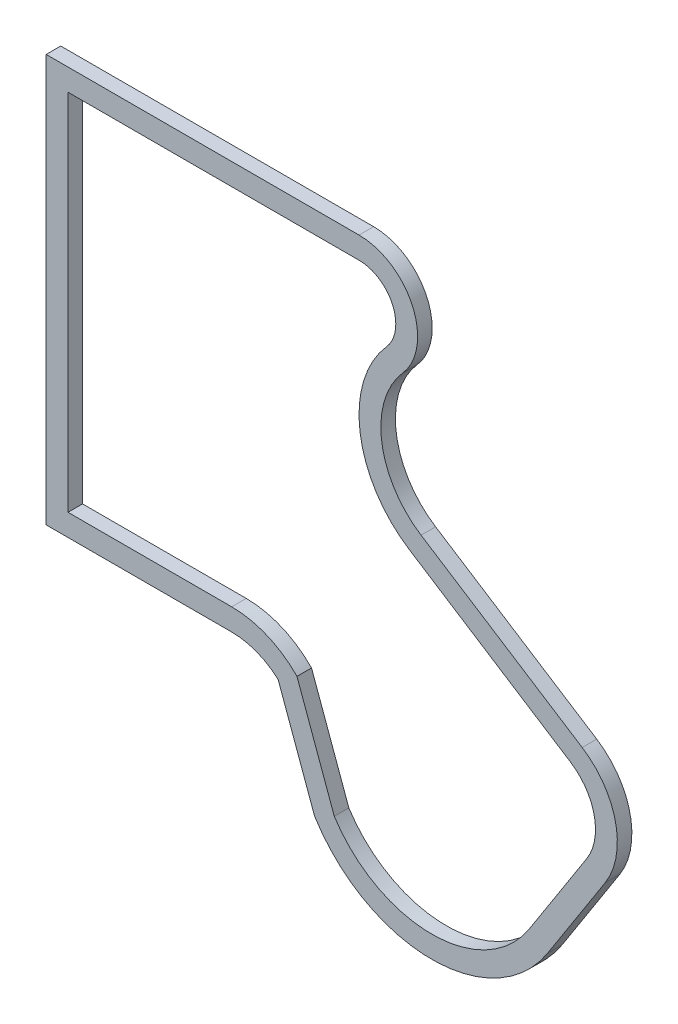
ISO-10303-21;
HEADER;
FILE_DESCRIPTION(('STEP AP214'),'2;1');
FILE_NAME('part.step','',(''),(''),'','','');
FILE_SCHEMA(('AUTOMOTIVE_DESIGN { 1 0 10303 214 1 1 1 1 }'));
ENDSEC;
DATA;
#1=APPLICATION_CONTEXT('core data for automotive mechanical design processes');
#2=APPLICATION_PROTOCOL_DEFINITION('international standard','automotive_design',2000,#1);
#3=PRODUCT_CONTEXT('',#1,'mechanical');
#4=PRODUCT('Part','Part','',(#3));
#5=PRODUCT_RELATED_PRODUCT_CATEGORY('part','',(#4));
#6=PRODUCT_DEFINITION_FORMATION('','',#4);
#7=PRODUCT_DEFINITION_CONTEXT('part definition',#1,'design');
#8=PRODUCT_DEFINITION('design','',#6,#7);
#9=PRODUCT_DEFINITION_SHAPE('','',#8);
#10=(LENGTH_UNIT() NAMED_UNIT(*) SI_UNIT(.MILLI.,.METRE.));
#11=(NAMED_UNIT(*) PLANE_ANGLE_UNIT() SI_UNIT($,.RADIAN.));
#12=(NAMED_UNIT(*) SI_UNIT($,.STERADIAN.) SOLID_ANGLE_UNIT());
#13=UNCERTAINTY_MEASURE_WITH_UNIT(LENGTH_MEASURE(1.E-05),#10,'distance_accuracy_value','');
#14=(GEOMETRIC_REPRESENTATION_CONTEXT(3) GLOBAL_UNCERTAINTY_ASSIGNED_CONTEXT((#13)) GLOBAL_UNIT_ASSIGNED_CONTEXT((#10,
#11,#12)) REPRESENTATION_CONTEXT('',''));
#15=CARTESIAN_POINT('',(0.,0.,0.));
#16=DIRECTION('',(0.,0.,1.));
#17=DIRECTION('',(1.,0.,0.));
#18=AXIS2_PLACEMENT_3D('',#15,#16,#17);
#19=CARTESIAN_POINT('',(57.15,-31.75,5.08));
#20=DIRECTION('',(0.,0.,-1.));
#21=DIRECTION('',(-1.,0.,0.));
#22=AXIS2_PLACEMENT_3D('',#19,#20,#21);
#23=PLANE('',#22);
#24=DIRECTION('',(1.,0.,0.));
#25=VECTOR('',#24,1.);
#26=CARTESIAN_POINT('',(-7.62,-7.62,5.08));
#27=LINE('',#26,#25);
#28=CARTESIAN_POINT('',(-7.62,-7.62,5.08));
#29=VERTEX_POINT('',#28);
#30=CARTESIAN_POINT('',(57.15,-7.62,5.08));
#31=VERTEX_POINT('',#30);
#32=EDGE_CURVE('E311',#29,#31,#27,.T.);
#33=ORIENTED_EDGE('',*,*,#32,.T.);
#34=CARTESIAN_POINT('',(57.15,-31.75,5.08));
#35=DIRECTION('',(0.,0.,-1.));
#36=DIRECTION('',(-1.,0.,0.));
#37=AXIS2_PLACEMENT_3D('',#34,#35,#36);
#38=CIRCLE('',#37,24.13);
#39=CARTESIAN_POINT('',(73.3701951159205,-13.8848895776861,5.08));
#40=VERTEX_POINT('',#39);
#41=EDGE_CURVE('E315',#31,#40,#38,.T.);
#42=ORIENTED_EDGE('',*,*,#41,.T.);
#43=DIRECTION('',(0.342020143325669,-0.939692620785908,0.));
#44=VECTOR('',#43,1.);
#45=CARTESIAN_POINT('',(73.3701951159205,-13.8848895776861,5.08));
#46=LINE('',#45,#44);
#47=CARTESIAN_POINT('',(86.0802479004247,-48.8054726031877,5.08));
#48=VERTEX_POINT('',#47);
#49=EDGE_CURVE('E319',#40,#48,#46,.T.);
#50=ORIENTED_EDGE('',*,*,#49,.T.);
#51=CARTESIAN_POINT('',(127.,-23.6138442919467,5.08));
#52=DIRECTION('',(0.,0.,1.));
#53=DIRECTION('',(1.,0.,0.));
#54=AXIS2_PLACEMENT_3D('',#51,#52,#53);
#55=CIRCLE('',#54,48.0525155310564);
#56=CARTESIAN_POINT('',(167.450498741756,-49.552259825776,5.08));
#57=VERTEX_POINT('',#56);
#58=EDGE_CURVE('E322',#48,#57,#55,.T.);
#59=ORIENTED_EDGE('',*,*,#58,.T.);
#60=DIRECTION('',(0.539793083612144,0.84179773513861,0.));
#61=VECTOR('',#60,1.);
#62=CARTESIAN_POINT('',(167.450498741756,-49.552259825776,5.08));
#63=LINE('',#62,#61);
#64=CARTESIAN_POINT('',(187.550745596147,-18.2062815399359,5.08));
#65=VERTEX_POINT('',#64);
#66=EDGE_CURVE('E325',#57,#65,#63,.T.);
#67=ORIENTED_EDGE('',*,*,#66,.T.);
#68=CARTESIAN_POINT('',(165.1,-3.81000000000001,5.08));
#69=DIRECTION('',(0.,0.,1.));
#70=DIRECTION('',(-1.,0.,0.));
#71=AXIS2_PLACEMENT_3D('',#68,#69,#70);
#72=CIRCLE('',#71,26.67);
#73=CARTESIAN_POINT('',(179.496281539936,18.6407455961467,5.08));
#74=VERTEX_POINT('',#73);
#75=EDGE_CURVE('E328',#65,#74,#72,.T.);
#76=ORIENTED_EDGE('',*,*,#75,.T.);
#77=DIRECTION('',(-0.84179773513861,0.539793083612144,0.));
#78=VECTOR('',#77,1.);
#79=CARTESIAN_POINT('',(123.247106811502,54.7098797953497,5.08));
#80=LINE('',#79,#78);
#81=CARTESIAN_POINT('',(123.247106811502,54.7098797953497,5.08));
#82=VERTEX_POINT('',#81);
#83=EDGE_CURVE('E331',#74,#82,#80,.T.);
#84=ORIENTED_EDGE('',*,*,#83,.T.);
#85=CARTESIAN_POINT('',(139.7,80.3678747623745,5.08));
#86=DIRECTION('',(0.,0.,-1.));
#87=DIRECTION('',(1.,0.,0.));
#88=AXIS2_PLACEMENT_3D('',#85,#86,#87);
#89=CIRCLE('',#88,30.48);
#90=CARTESIAN_POINT('',(116.899219219543,100.595449896373,5.08));
#91=VERTEX_POINT('',#90);
#92=EDGE_CURVE('E334',#82,#91,#89,.T.);
#93=ORIENTED_EDGE('',*,*,#92,.T.);
#94=CARTESIAN_POINT('',(101.6,114.168059941379,5.08));
#95=DIRECTION('',(0.,0.,1.));
#96=DIRECTION('',(-1.,0.,0.));
#97=AXIS2_PLACEMENT_3D('',#94,#95,#96);
#98=CIRCLE('',#97,20.4519400586212);
#99=CARTESIAN_POINT('',(101.6,134.62,5.08));
#100=VERTEX_POINT('',#99);
#101=EDGE_CURVE('E337',#91,#100,#98,.T.);
#102=ORIENTED_EDGE('',*,*,#101,.T.);
#103=DIRECTION('',(-1.,0.,0.));
#104=VECTOR('',#103,1.);
#105=CARTESIAN_POINT('',(-7.62,134.62,5.08));
#106=LINE('',#105,#104);
#107=CARTESIAN_POINT('',(-7.62,134.62,5.08));
#108=VERTEX_POINT('',#107);
#109=EDGE_CURVE('E340',#100,#108,#106,.T.);
#110=ORIENTED_EDGE('',*,*,#109,.T.);
#111=DIRECTION('',(0.,-1.,0.));
#112=VECTOR('',#111,1.);
#113=CARTESIAN_POINT('',(-7.62,-7.62,5.08));
#114=LINE('',#113,#112);
#115=EDGE_CURVE('E343',#108,#29,#114,.T.);
#116=ORIENTED_EDGE('',*,*,#115,.T.);
#117=EDGE_LOOP('',(#33,#42,#50,#59,#67,#76,#84,#93,#102,#110,#116));
#118=FACE_BOUND('',#117,.T.);
#119=DIRECTION('',(1.,0.,0.));
#120=VECTOR('',#119,1.);
#121=CARTESIAN_POINT('',(0.,0.,5.08));
#122=LINE('',#121,#120);
#123=CARTESIAN_POINT('',(0.,0.,5.08));
#124=VERTEX_POINT('',#123);
#125=CARTESIAN_POINT('',(57.15,0.,5.08));
#126=VERTEX_POINT('',#125);
#127=EDGE_CURVE('E191',#124,#126,#122,.T.);
#128=ORIENTED_EDGE('',*,*,#127,.F.);
#129=DIRECTION('',(0.,-1.,0.));
#130=VECTOR('',#129,1.);
#131=CARTESIAN_POINT('',(0.,0.,5.08));
#132=LINE('',#131,#130);
#133=CARTESIAN_POINT('',(0.,127.,5.08));
#134=VERTEX_POINT('',#133);
#135=EDGE_CURVE('E242',#134,#124,#132,.T.);
#136=ORIENTED_EDGE('',*,*,#135,.F.);
#137=DIRECTION('',(-1.,0.,0.));
#138=VECTOR('',#137,1.);
#139=CARTESIAN_POINT('',(0.,127.,5.08));
#140=LINE('',#139,#138);
#141=CARTESIAN_POINT('',(101.6,127.,5.08));
#142=VERTEX_POINT('',#141);
#143=EDGE_CURVE('E239',#142,#134,#140,.T.);
#144=ORIENTED_EDGE('',*,*,#143,.F.);
#145=CARTESIAN_POINT('',(101.6,114.168059941379,5.08));
#146=DIRECTION('',(0.,0.,1.));
#147=DIRECTION('',(-1.,0.,0.));
#148=AXIS2_PLACEMENT_3D('',#145,#146,#147);
#149=CIRCLE('',#148,12.8319400586212);
#150=CARTESIAN_POINT('',(111.199024024429,105.652343679872,5.08));
#151=VERTEX_POINT('',#150);
#152=EDGE_CURVE('E236',#151,#142,#149,.T.);
#153=ORIENTED_EDGE('',*,*,#152,.F.);
#154=CARTESIAN_POINT('',(139.7,80.3678747623745,5.08));
#155=DIRECTION('',(0.,0.,-1.));
#156=DIRECTION('',(1.,0.,0.));
#157=AXIS2_PLACEMENT_3D('',#154,#155,#156);
#158=CIRCLE('',#157,38.1);
#159=CARTESIAN_POINT('',(119.133883514377,48.2953810535935,5.08));
#160=VERTEX_POINT('',#159);
#161=EDGE_CURVE('E233',#160,#151,#158,.T.);
#162=ORIENTED_EDGE('',*,*,#161,.F.);
#163=DIRECTION('',(-0.84179773513861,0.539793083612144,0.));
#164=VECTOR('',#163,1.);
#165=CARTESIAN_POINT('',(119.133883514377,48.2953810535935,5.08));
#166=LINE('',#165,#164);
#167=CARTESIAN_POINT('',(175.383058242811,12.2262468543905,5.08));
#168=VERTEX_POINT('',#167);
#169=EDGE_CURVE('E230',#168,#160,#166,.T.);
#170=ORIENTED_EDGE('',*,*,#169,.F.);
#171=CARTESIAN_POINT('',(165.1,-3.81000000000001,5.08));
#172=DIRECTION('',(0.,0.,1.));
#173=DIRECTION('',(-1.,0.,0.));
#174=AXIS2_PLACEMENT_3D('',#171,#172,#173);
#175=CIRCLE('',#174,19.05);
#176=CARTESIAN_POINT('',(181.136246854391,-14.0930582428113,5.08));
#177=VERTEX_POINT('',#176);
#178=EDGE_CURVE('E227',#177,#168,#175,.T.);
#179=ORIENTED_EDGE('',*,*,#178,.F.);
#180=DIRECTION('',(0.539793083612144,0.84179773513861,0.));
#181=VECTOR('',#180,1.);
#182=CARTESIAN_POINT('',(161.036,-45.4390365286515,5.08));
#183=LINE('',#182,#181);
#184=CARTESIAN_POINT('',(161.036,-45.4390365286515,5.08));
#185=VERTEX_POINT('',#184);
#186=EDGE_CURVE('E224',#185,#177,#183,.T.);
#187=ORIENTED_EDGE('',*,*,#186,.F.);
#188=CARTESIAN_POINT('',(127.,-23.6138442919467,5.08));
#189=DIRECTION('',(0.,0.,1.));
#190=DIRECTION('',(1.,0.,0.));
#191=AXIS2_PLACEMENT_3D('',#188,#189,#190);
#192=CIRCLE('',#191,40.4325155310564);
#193=CARTESIAN_POINT('',(92.964,-45.4390365286515,5.08));
#194=VERTEX_POINT('',#193);
#195=EDGE_CURVE('E219',#194,#185,#192,.T.);
#196=ORIENTED_EDGE('',*,*,#195,.F.);
#197=DIRECTION('',(0.342020143325669,-0.939692620785908,0.));
#198=VECTOR('',#197,1.);
#199=CARTESIAN_POINT('',(79.933032539292,-9.63674767670839,5.08));
#200=LINE('',#199,#198);
#201=CARTESIAN_POINT('',(79.933032539292,-9.63674767670839,5.08));
#202=VERTEX_POINT('',#201);
#203=EDGE_CURVE('E214',#202,#194,#200,.T.);
#204=ORIENTED_EDGE('',*,*,#203,.F.);
#205=CARTESIAN_POINT('',(57.15,-31.75,5.08));
#206=DIRECTION('',(0.,0.,-1.));
#207=DIRECTION('',(-1.,0.,0.));
#208=AXIS2_PLACEMENT_3D('',#205,#206,#207);
#209=CIRCLE('',#208,31.75);
#210=EDGE_CURVE('E200',#126,#202,#209,.T.);
#211=ORIENTED_EDGE('',*,*,#210,.F.);
#212=EDGE_LOOP('',(#128,#136,#144,#153,#162,#170,#179,#187,#196,#204,#211));
#213=FACE_BOUND('',#212,.T.);
#214=ADVANCED_FACE('F41',(#118,#213),#23,.F.);
#215=CARTESIAN_POINT('',(57.15,-31.75,0.));
#216=DIRECTION('',(0.,0.,-1.));
#217=DIRECTION('',(-1.,0.,0.));
#218=AXIS2_PLACEMENT_3D('',#215,#216,#217);
#219=PLANE('',#218);
#220=DIRECTION('',(1.,0.,0.));
#221=VECTOR('',#220,1.);
#222=CARTESIAN_POINT('',(-7.62,-7.62,0.));
#223=LINE('',#222,#221);
#224=CARTESIAN_POINT('',(-7.62,-7.62,0.));
#225=VERTEX_POINT('',#224);
#226=CARTESIAN_POINT('',(57.15,-7.62,0.));
#227=VERTEX_POINT('',#226);
#228=EDGE_CURVE('E209',#225,#227,#223,.T.);
#229=ORIENTED_EDGE('',*,*,#228,.F.);
#230=DIRECTION('',(0.,-1.,0.));
#231=VECTOR('',#230,1.);
#232=CARTESIAN_POINT('',(-7.62,-7.62,0.));
#233=LINE('',#232,#231);
#234=CARTESIAN_POINT('',(-7.62,134.62,0.));
#235=VERTEX_POINT('',#234);
#236=EDGE_CURVE('E316',#235,#225,#233,.T.);
#237=ORIENTED_EDGE('',*,*,#236,.F.);
#238=DIRECTION('',(-1.,0.,0.));
#239=VECTOR('',#238,1.);
#240=CARTESIAN_POINT('',(-7.62,134.62,0.));
#241=LINE('',#240,#239);
#242=CARTESIAN_POINT('',(101.6,134.62,0.));
#243=VERTEX_POINT('',#242);
#244=EDGE_CURVE('E374',#243,#235,#241,.T.);
#245=ORIENTED_EDGE('',*,*,#244,.F.);
#246=CARTESIAN_POINT('',(101.6,114.168059941379,0.));
#247=DIRECTION('',(0.,0.,1.));
#248=DIRECTION('',(-1.,0.,0.));
#249=AXIS2_PLACEMENT_3D('',#246,#247,#248);
#250=CIRCLE('',#249,20.4519400586212);
#251=CARTESIAN_POINT('',(116.899219219543,100.595449896373,0.));
#252=VERTEX_POINT('',#251);
#253=EDGE_CURVE('E371',#252,#243,#250,.T.);
#254=ORIENTED_EDGE('',*,*,#253,.F.);
#255=CARTESIAN_POINT('',(139.7,80.3678747623745,0.));
#256=DIRECTION('',(0.,0.,-1.));
#257=DIRECTION('',(1.,0.,0.));
#258=AXIS2_PLACEMENT_3D('',#255,#256,#257);
#259=CIRCLE('',#258,30.48);
#260=CARTESIAN_POINT('',(123.247106811502,54.7098797953497,0.));
#261=VERTEX_POINT('',#260);
#262=EDGE_CURVE('E368',#261,#252,#259,.T.);
#263=ORIENTED_EDGE('',*,*,#262,.F.);
#264=DIRECTION('',(-0.84179773513861,0.539793083612144,0.));
#265=VECTOR('',#264,1.);
#266=CARTESIAN_POINT('',(123.247106811502,54.7098797953497,0.));
#267=LINE('',#266,#265);
#268=CARTESIAN_POINT('',(179.496281539936,18.6407455961467,0.));
#269=VERTEX_POINT('',#268);
#270=EDGE_CURVE('E365',#269,#261,#267,.T.);
#271=ORIENTED_EDGE('',*,*,#270,.F.);
#272=CARTESIAN_POINT('',(165.1,-3.81000000000001,0.));
#273=DIRECTION('',(0.,0.,1.));
#274=DIRECTION('',(-1.,0.,0.));
#275=AXIS2_PLACEMENT_3D('',#272,#273,#274);
#276=CIRCLE('',#275,26.67);
#277=CARTESIAN_POINT('',(187.550745596147,-18.2062815399359,0.));
#278=VERTEX_POINT('',#277);
#279=EDGE_CURVE('E362',#278,#269,#276,.T.);
#280=ORIENTED_EDGE('',*,*,#279,.F.);
#281=DIRECTION('',(0.539793083612144,0.84179773513861,0.));
#282=VECTOR('',#281,1.);
#283=CARTESIAN_POINT('',(167.450498741756,-49.552259825776,0.));
#284=LINE('',#283,#282);
#285=CARTESIAN_POINT('',(167.450498741756,-49.552259825776,0.));
#286=VERTEX_POINT('',#285);
#287=EDGE_CURVE('E359',#286,#278,#284,.T.);
#288=ORIENTED_EDGE('',*,*,#287,.F.);
#289=CARTESIAN_POINT('',(127.,-23.6138442919467,0.));
#290=DIRECTION('',(0.,0.,1.));
#291=DIRECTION('',(1.,0.,0.));
#292=AXIS2_PLACEMENT_3D('',#289,#290,#291);
#293=CIRCLE('',#292,48.0525155310564);
#294=CARTESIAN_POINT('',(86.0802479004247,-48.8054726031877,0.));
#295=VERTEX_POINT('',#294);
#296=EDGE_CURVE('E356',#295,#286,#293,.T.);
#297=ORIENTED_EDGE('',*,*,#296,.F.);
#298=DIRECTION('',(0.342020143325669,-0.939692620785908,0.));
#299=VECTOR('',#298,1.);
#300=CARTESIAN_POINT('',(73.3701951159205,-13.8848895776861,0.));
#301=LINE('',#300,#299);
#302=CARTESIAN_POINT('',(73.3701951159205,-13.8848895776861,0.));
#303=VERTEX_POINT('',#302);
#304=EDGE_CURVE('E353',#303,#295,#301,.T.);
#305=ORIENTED_EDGE('',*,*,#304,.F.);
#306=CARTESIAN_POINT('',(57.15,-31.75,0.));
#307=DIRECTION('',(0.,0.,-1.));
#308=DIRECTION('',(-1.,0.,0.));
#309=AXIS2_PLACEMENT_3D('',#306,#307,#308);
#310=CIRCLE('',#309,24.13);
#311=EDGE_CURVE('E350',#227,#303,#310,.T.);
#312=ORIENTED_EDGE('',*,*,#311,.F.);
#313=EDGE_LOOP('',(#229,#237,#245,#254,#263,#271,#280,#288,#297,#305,#312));
#314=FACE_BOUND('',#313,.T.);
#315=DIRECTION('',(0.,-1.,0.));
#316=VECTOR('',#315,1.);
#317=CARTESIAN_POINT('',(0.,0.,0.));
#318=LINE('',#317,#316);
#319=CARTESIAN_POINT('',(0.,127.,0.));
#320=VERTEX_POINT('',#319);
#321=CARTESIAN_POINT('',(0.,0.,0.));
#322=VERTEX_POINT('',#321);
#323=EDGE_CURVE('E201',#320,#322,#318,.T.);
#324=ORIENTED_EDGE('',*,*,#323,.T.);
#325=DIRECTION('',(1.,0.,0.));
#326=VECTOR('',#325,1.);
#327=CARTESIAN_POINT('',(0.,0.,0.));
#328=LINE('',#327,#326);
#329=CARTESIAN_POINT('',(57.15,0.,0.));
#330=VERTEX_POINT('',#329);
#331=EDGE_CURVE('E65',#322,#330,#328,.T.);
#332=ORIENTED_EDGE('',*,*,#331,.T.);
#333=CARTESIAN_POINT('',(57.15,-31.75,0.));
#334=DIRECTION('',(0.,0.,-1.));
#335=DIRECTION('',(-1.,0.,0.));
#336=AXIS2_PLACEMENT_3D('',#333,#334,#335);
#337=CIRCLE('',#336,31.75);
#338=CARTESIAN_POINT('',(79.933032539292,-9.63674767670839,0.));
#339=VERTEX_POINT('',#338);
#340=EDGE_CURVE('E207',#330,#339,#337,.T.);
#341=ORIENTED_EDGE('',*,*,#340,.T.);
#342=DIRECTION('',(0.342020143325669,-0.939692620785908,0.));
#343=VECTOR('',#342,1.);
#344=CARTESIAN_POINT('',(79.933032539292,-9.63674767670839,0.));
#345=LINE('',#344,#343);
#346=CARTESIAN_POINT('',(92.964,-45.4390365286515,0.));
#347=VERTEX_POINT('',#346);
#348=EDGE_CURVE('E249',#339,#347,#345,.T.);
#349=ORIENTED_EDGE('',*,*,#348,.T.);
#350=CARTESIAN_POINT('',(127.,-23.6138442919467,0.));
#351=DIRECTION('',(0.,0.,1.));
#352=DIRECTION('',(1.,0.,0.));
#353=AXIS2_PLACEMENT_3D('',#350,#351,#352);
#354=CIRCLE('',#353,40.4325155310564);
#355=CARTESIAN_POINT('',(161.036,-45.4390365286515,0.));
#356=VERTEX_POINT('',#355);
#357=EDGE_CURVE('E253',#347,#356,#354,.T.);
#358=ORIENTED_EDGE('',*,*,#357,.T.);
#359=DIRECTION('',(0.539793083612144,0.84179773513861,0.));
#360=VECTOR('',#359,1.);
#361=CARTESIAN_POINT('',(161.036,-45.4390365286515,0.));
#362=LINE('',#361,#360);
#363=CARTESIAN_POINT('',(181.136246854391,-14.0930582428113,0.));
#364=VERTEX_POINT('',#363);
#365=EDGE_CURVE('E257',#356,#364,#362,.T.);
#366=ORIENTED_EDGE('',*,*,#365,.T.);
#367=CARTESIAN_POINT('',(165.1,-3.81000000000001,0.));
#368=DIRECTION('',(0.,0.,1.));
#369=DIRECTION('',(-1.,0.,0.));
#370=AXIS2_PLACEMENT_3D('',#367,#368,#369);
#371=CIRCLE('',#370,19.05);
#372=CARTESIAN_POINT('',(175.383058242811,12.2262468543905,0.));
#373=VERTEX_POINT('',#372);
#374=EDGE_CURVE('E261',#364,#373,#371,.T.);
#375=ORIENTED_EDGE('',*,*,#374,.T.);
#376=DIRECTION('',(-0.84179773513861,0.539793083612144,0.));
#377=VECTOR('',#376,1.);
#378=CARTESIAN_POINT('',(119.133883514377,48.2953810535935,0.));
#379=LINE('',#378,#377);
#380=CARTESIAN_POINT('',(119.133883514377,48.2953810535935,0.));
#381=VERTEX_POINT('',#380);
#382=EDGE_CURVE('E265',#373,#381,#379,.T.);
#383=ORIENTED_EDGE('',*,*,#382,.T.);
#384=CARTESIAN_POINT('',(139.7,80.3678747623745,0.));
#385=DIRECTION('',(0.,0.,-1.));
#386=DIRECTION('',(1.,0.,0.));
#387=AXIS2_PLACEMENT_3D('',#384,#385,#386);
#388=CIRCLE('',#387,38.1);
#389=CARTESIAN_POINT('',(111.199024024429,105.652343679872,0.));
#390=VERTEX_POINT('',#389);
#391=EDGE_CURVE('E269',#381,#390,#388,.T.);
#392=ORIENTED_EDGE('',*,*,#391,.T.);
#393=CARTESIAN_POINT('',(101.6,114.168059941379,0.));
#394=DIRECTION('',(0.,0.,1.));
#395=DIRECTION('',(-1.,0.,0.));
#396=AXIS2_PLACEMENT_3D('',#393,#394,#395);
#397=CIRCLE('',#396,12.8319400586212);
#398=CARTESIAN_POINT('',(101.6,127.,0.));
#399=VERTEX_POINT('',#398);
#400=EDGE_CURVE('E273',#390,#399,#397,.T.);
#401=ORIENTED_EDGE('',*,*,#400,.T.);
#402=DIRECTION('',(-1.,0.,0.));
#403=VECTOR('',#402,1.);
#404=CARTESIAN_POINT('',(0.,127.,0.));
#405=LINE('',#404,#403);
#406=EDGE_CURVE('E277',#399,#320,#405,.T.);
#407=ORIENTED_EDGE('',*,*,#406,.T.);
#408=EDGE_LOOP('',(#324,#332,#341,#349,#358,#366,#375,#383,#392,#401,#407));
#409=FACE_BOUND('',#408,.T.);
#410=ADVANCED_FACE('F426',(#314,#409),#219,.T.);
#411=CARTESIAN_POINT('',(-7.62,-7.62,5.08));
#412=DIRECTION('',(0.,1.,0.));
#413=DIRECTION('',(-1.,0.,0.));
#414=AXIS2_PLACEMENT_3D('',#411,#412,#413);
#415=PLANE('',#414);
#416=ORIENTED_EDGE('',*,*,#228,.T.);
#417=DIRECTION('',(0.,0.,-1.));
#418=VECTOR('',#417,1.);
#419=CARTESIAN_POINT('',(57.15,-7.62,5.08));
#420=LINE('',#419,#418);
#421=EDGE_CURVE('E11',#31,#227,#420,.T.);
#422=ORIENTED_EDGE('',*,*,#421,.F.);
#423=ORIENTED_EDGE('',*,*,#32,.F.);
#424=DIRECTION('',(0.,0.,-1.));
#425=VECTOR('',#424,1.);
#426=CARTESIAN_POINT('',(-7.62,-7.62,5.08));
#427=LINE('',#426,#425);
#428=EDGE_CURVE('E346',#29,#225,#427,.T.);
#429=ORIENTED_EDGE('',*,*,#428,.T.);
#430=EDGE_LOOP('',(#416,#422,#423,#429));
#431=FACE_BOUND('',#430,.T.);
#432=ADVANCED_FACE('F43',(#431),#415,.F.);
#433=CARTESIAN_POINT('',(57.15,-31.75,5.08));
#434=DIRECTION('',(0.,0.,-1.));
#435=DIRECTION('',(-1.,0.,0.));
#436=AXIS2_PLACEMENT_3D('',#433,#434,#435);
#437=CYLINDRICAL_SURFACE('',#436,24.13);
#438=ORIENTED_EDGE('',*,*,#311,.T.);
#439=DIRECTION('',(0.,0.,-1.));
#440=VECTOR('',#439,1.);
#441=CARTESIAN_POINT('',(73.3701951159205,-13.8848895776861,5.08));
#442=LINE('',#441,#440);
#443=EDGE_CURVE('E50',#40,#303,#442,.T.);
#444=ORIENTED_EDGE('',*,*,#443,.F.);
#445=ORIENTED_EDGE('',*,*,#41,.F.);
#446=ORIENTED_EDGE('',*,*,#421,.T.);
#447=EDGE_LOOP('',(#438,#444,#445,#446));
#448=FACE_BOUND('',#447,.T.);
#449=ADVANCED_FACE('F443',(#448),#437,.F.);
#450=CARTESIAN_POINT('',(73.3701951159205,-13.8848895776861,5.08));
#451=DIRECTION('',(0.939692620785908,0.342020143325669,0.));
#452=DIRECTION('',(-0.342020143325669,0.939692620785908,0.));
#453=AXIS2_PLACEMENT_3D('',#450,#451,#452);
#454=PLANE('',#453);
#455=ORIENTED_EDGE('',*,*,#304,.T.);
#456=DIRECTION('',(0.,0.,-1.));
#457=VECTOR('',#456,1.);
#458=CARTESIAN_POINT('',(86.0802479004247,-48.8054726031877,5.08));
#459=LINE('',#458,#457);
#460=EDGE_CURVE('E410',#48,#295,#459,.T.);
#461=ORIENTED_EDGE('',*,*,#460,.F.);
#462=ORIENTED_EDGE('',*,*,#49,.F.);
#463=ORIENTED_EDGE('',*,*,#443,.T.);
#464=EDGE_LOOP('',(#455,#461,#462,#463));
#465=FACE_BOUND('',#464,.T.);
#466=ADVANCED_FACE('F420',(#465),#454,.F.);
#467=CARTESIAN_POINT('',(127.,-23.6138442919467,5.08));
#468=DIRECTION('',(0.,0.,-1.));
#469=DIRECTION('',(-1.,0.,0.));
#470=AXIS2_PLACEMENT_3D('',#467,#468,#469);
#471=CYLINDRICAL_SURFACE('',#470,48.0525155310564);
#472=ORIENTED_EDGE('',*,*,#296,.T.);
#473=DIRECTION('',(0.,0.,-1.));
#474=VECTOR('',#473,1.);
#475=CARTESIAN_POINT('',(167.450498741756,-49.552259825776,5.08));
#476=LINE('',#475,#474);
#477=EDGE_CURVE('E406',#57,#286,#476,.T.);
#478=ORIENTED_EDGE('',*,*,#477,.F.);
#479=ORIENTED_EDGE('',*,*,#58,.F.);
#480=ORIENTED_EDGE('',*,*,#460,.T.);
#481=EDGE_LOOP('',(#472,#478,#479,#480));
#482=FACE_BOUND('',#481,.T.);
#483=ADVANCED_FACE('F432',(#482),#471,.T.);
#484=CARTESIAN_POINT('',(167.450498741756,-49.552259825776,5.08));
#485=DIRECTION('',(-0.84179773513861,0.539793083612144,0.));
#486=DIRECTION('',(-0.539793083612144,-0.84179773513861,0.));
#487=AXIS2_PLACEMENT_3D('',#484,#485,#486);
#488=PLANE('',#487);
#489=ORIENTED_EDGE('',*,*,#287,.T.);
#490=DIRECTION('',(0.,0.,-1.));
#491=VECTOR('',#490,1.);
#492=CARTESIAN_POINT('',(187.550745596147,-18.2062815399359,5.08));
#493=LINE('',#492,#491);
#494=EDGE_CURVE('E402',#65,#278,#493,.T.);
#495=ORIENTED_EDGE('',*,*,#494,.F.);
#496=ORIENTED_EDGE('',*,*,#66,.F.);
#497=ORIENTED_EDGE('',*,*,#477,.T.);
#498=EDGE_LOOP('',(#489,#495,#496,#497));
#499=FACE_BOUND('',#498,.T.);
#500=ADVANCED_FACE('F436',(#499),#488,.F.);
#501=CARTESIAN_POINT('',(165.1,-3.81000000000001,5.08));
#502=DIRECTION('',(0.,0.,-1.));
#503=DIRECTION('',(-1.,0.,0.));
#504=AXIS2_PLACEMENT_3D('',#501,#502,#503);
#505=CYLINDRICAL_SURFACE('',#504,26.67);
#506=ORIENTED_EDGE('',*,*,#279,.T.);
#507=DIRECTION('',(0.,0.,-1.));
#508=VECTOR('',#507,1.);
#509=CARTESIAN_POINT('',(179.496281539936,18.6407455961467,5.08));
#510=LINE('',#509,#508);
#511=EDGE_CURVE('E398',#74,#269,#510,.T.);
#512=ORIENTED_EDGE('',*,*,#511,.F.);
#513=ORIENTED_EDGE('',*,*,#75,.F.);
#514=ORIENTED_EDGE('',*,*,#494,.T.);
#515=EDGE_LOOP('',(#506,#512,#513,#514));
#516=FACE_BOUND('',#515,.T.);
#517=ADVANCED_FACE('F471',(#516),#505,.T.);
#518=CARTESIAN_POINT('',(123.247106811502,54.7098797953497,5.08));
#519=DIRECTION('',(-0.539793083612144,-0.84179773513861,0.));
#520=DIRECTION('',(0.84179773513861,-0.539793083612144,0.));
#521=AXIS2_PLACEMENT_3D('',#518,#519,#520);
#522=PLANE('',#521);
#523=ORIENTED_EDGE('',*,*,#270,.T.);
#524=DIRECTION('',(0.,0.,-1.));
#525=VECTOR('',#524,1.);
#526=CARTESIAN_POINT('',(123.247106811502,54.7098797953497,5.08));
#527=LINE('',#526,#525);
#528=EDGE_CURVE('E394',#82,#261,#527,.T.);
#529=ORIENTED_EDGE('',*,*,#528,.F.);
#530=ORIENTED_EDGE('',*,*,#83,.F.);
#531=ORIENTED_EDGE('',*,*,#511,.T.);
#532=EDGE_LOOP('',(#523,#529,#530,#531));
#533=FACE_BOUND('',#532,.T.);
#534=ADVANCED_FACE('F469',(#533),#522,.F.);
#535=CARTESIAN_POINT('',(139.7,80.3678747623745,5.08));
#536=DIRECTION('',(0.,0.,-1.));
#537=DIRECTION('',(-1.,0.,0.));
#538=AXIS2_PLACEMENT_3D('',#535,#536,#537);
#539=CYLINDRICAL_SURFACE('',#538,30.48);
#540=ORIENTED_EDGE('',*,*,#262,.T.);
#541=DIRECTION('',(0.,0.,-1.));
#542=VECTOR('',#541,1.);
#543=CARTESIAN_POINT('',(116.899219219543,100.595449896373,5.08));
#544=LINE('',#543,#542);
#545=EDGE_CURVE('E390',#91,#252,#544,.T.);
#546=ORIENTED_EDGE('',*,*,#545,.F.);
#547=ORIENTED_EDGE('',*,*,#92,.F.);
#548=ORIENTED_EDGE('',*,*,#528,.T.);
#549=EDGE_LOOP('',(#540,#546,#547,#548));
#550=FACE_BOUND('',#549,.T.);
#551=ADVANCED_FACE('F464',(#550),#539,.F.);
#552=CARTESIAN_POINT('',(101.6,114.168059941379,5.08));
#553=DIRECTION('',(0.,0.,-1.));
#554=DIRECTION('',(-1.,0.,0.));
#555=AXIS2_PLACEMENT_3D('',#552,#553,#554);
#556=CYLINDRICAL_SURFACE('',#555,20.4519400586212);
#557=ORIENTED_EDGE('',*,*,#253,.T.);
#558=DIRECTION('',(0.,0.,-1.));
#559=VECTOR('',#558,1.);
#560=CARTESIAN_POINT('',(101.6,134.62,5.08));
#561=LINE('',#560,#559);
#562=EDGE_CURVE('E386',#100,#243,#561,.T.);
#563=ORIENTED_EDGE('',*,*,#562,.F.);
#564=ORIENTED_EDGE('',*,*,#101,.F.);
#565=ORIENTED_EDGE('',*,*,#545,.T.);
#566=EDGE_LOOP('',(#557,#563,#564,#565));
#567=FACE_BOUND('',#566,.T.);
#568=ADVANCED_FACE('F459',(#567),#556,.T.);
#569=CARTESIAN_POINT('',(-7.62,134.62,5.08));
#570=DIRECTION('',(0.,-1.,0.));
#571=DIRECTION('',(0.,0.,-1.));
#572=AXIS2_PLACEMENT_3D('',#569,#570,#571);
#573=PLANE('',#572);
#574=ORIENTED_EDGE('',*,*,#244,.T.);
#575=DIRECTION('',(0.,0.,-1.));
#576=VECTOR('',#575,1.);
#577=CARTESIAN_POINT('',(-7.62,134.62,5.08));
#578=LINE('',#577,#576);
#579=EDGE_CURVE('E382',#108,#235,#578,.T.);
#580=ORIENTED_EDGE('',*,*,#579,.F.);
#581=ORIENTED_EDGE('',*,*,#109,.F.);
#582=ORIENTED_EDGE('',*,*,#562,.T.);
#583=EDGE_LOOP('',(#574,#580,#581,#582));
#584=FACE_BOUND('',#583,.T.);
#585=ADVANCED_FACE('F455',(#584),#573,.F.);
#586=CARTESIAN_POINT('',(-7.62,-7.62,5.08));
#587=DIRECTION('',(1.,0.,0.));
#588=DIRECTION('',(0.,0.,-1.));
#589=AXIS2_PLACEMENT_3D('',#586,#587,#588);
#590=PLANE('',#589);
#591=ORIENTED_EDGE('',*,*,#236,.T.);
#592=ORIENTED_EDGE('',*,*,#428,.F.);
#593=ORIENTED_EDGE('',*,*,#115,.F.);
#594=ORIENTED_EDGE('',*,*,#579,.T.);
#595=EDGE_LOOP('',(#591,#592,#593,#594));
#596=FACE_BOUND('',#595,.T.);
#597=ADVANCED_FACE('F450',(#596),#590,.F.);
#598=CARTESIAN_POINT('',(0.,0.,5.08));
#599=DIRECTION('',(0.,1.,0.));
#600=DIRECTION('',(0.,0.,1.));
#601=AXIS2_PLACEMENT_3D('',#598,#599,#600);
#602=PLANE('',#601);
#603=ORIENTED_EDGE('',*,*,#331,.F.);
#604=DIRECTION('',(0.,0.,-1.));
#605=VECTOR('',#604,1.);
#606=CARTESIAN_POINT('',(0.,0.,5.08));
#607=LINE('',#606,#605);
#608=EDGE_CURVE('E195',#124,#322,#607,.T.);
#609=ORIENTED_EDGE('',*,*,#608,.F.);
#610=ORIENTED_EDGE('',*,*,#127,.T.);
#611=DIRECTION('',(0.,0.,-1.));
#612=VECTOR('',#611,1.);
#613=CARTESIAN_POINT('',(57.15,0.,5.08));
#614=LINE('',#613,#612);
#615=EDGE_CURVE('E194',#126,#330,#614,.T.);
#616=ORIENTED_EDGE('',*,*,#615,.T.);
#617=EDGE_LOOP('',(#603,#609,#610,#616));
#618=FACE_BOUND('',#617,.T.);
#619=ADVANCED_FACE('F193',(#618),#602,.T.);
#620=CARTESIAN_POINT('',(57.15,-31.75,5.08));
#621=DIRECTION('',(0.,0.,-1.));
#622=DIRECTION('',(-1.,0.,0.));
#623=AXIS2_PLACEMENT_3D('',#620,#621,#622);
#624=CYLINDRICAL_SURFACE('',#623,31.75);
#625=ORIENTED_EDGE('',*,*,#340,.F.);
#626=ORIENTED_EDGE('',*,*,#615,.F.);
#627=ORIENTED_EDGE('',*,*,#210,.T.);
#628=DIRECTION('',(0.,0.,-1.));
#629=VECTOR('',#628,1.);
#630=CARTESIAN_POINT('',(79.933032539292,-9.63674767670839,5.08));
#631=LINE('',#630,#629);
#632=EDGE_CURVE('E210',#202,#339,#631,.T.);
#633=ORIENTED_EDGE('',*,*,#632,.T.);
#634=EDGE_LOOP('',(#625,#626,#627,#633));
#635=FACE_BOUND('',#634,.T.);
#636=ADVANCED_FACE('F204',(#635),#624,.T.);
#637=CARTESIAN_POINT('',(79.933032539292,-9.63674767670839,5.08));
#638=DIRECTION('',(0.939692620785908,0.342020143325669,0.));
#639=DIRECTION('',(-0.342020143325669,0.939692620785908,0.));
#640=AXIS2_PLACEMENT_3D('',#637,#638,#639);
#641=PLANE('',#640);
#642=ORIENTED_EDGE('',*,*,#348,.F.);
#643=ORIENTED_EDGE('',*,*,#632,.F.);
#644=ORIENTED_EDGE('',*,*,#203,.T.);
#645=DIRECTION('',(0.,0.,-1.));
#646=VECTOR('',#645,1.);
#647=CARTESIAN_POINT('',(92.964,-45.4390365286515,5.08));
#648=LINE('',#647,#646);
#649=EDGE_CURVE('E306',#194,#347,#648,.T.);
#650=ORIENTED_EDGE('',*,*,#649,.T.);
#651=EDGE_LOOP('',(#642,#643,#644,#650));
#652=FACE_BOUND('',#651,.T.);
#653=ADVANCED_FACE('F528',(#652),#641,.T.);
#654=CARTESIAN_POINT('',(127.,-23.6138442919467,5.08));
#655=DIRECTION('',(0.,0.,-1.));
#656=DIRECTION('',(-1.,0.,0.));
#657=AXIS2_PLACEMENT_3D('',#654,#655,#656);
#658=CYLINDRICAL_SURFACE('',#657,40.4325155310564);
#659=ORIENTED_EDGE('',*,*,#357,.F.);
#660=ORIENTED_EDGE('',*,*,#649,.F.);
#661=ORIENTED_EDGE('',*,*,#195,.T.);
#662=DIRECTION('',(0.,0.,-1.));
#663=VECTOR('',#662,1.);
#664=CARTESIAN_POINT('',(161.036,-45.4390365286515,5.08));
#665=LINE('',#664,#663);
#666=EDGE_CURVE('E303',#185,#356,#665,.T.);
#667=ORIENTED_EDGE('',*,*,#666,.T.);
#668=EDGE_LOOP('',(#659,#660,#661,#667));
#669=FACE_BOUND('',#668,.T.);
#670=ADVANCED_FACE('F535',(#669),#658,.F.);
#671=CARTESIAN_POINT('',(161.036,-45.4390365286515,5.08));
#672=DIRECTION('',(-0.84179773513861,0.539793083612144,0.));
#673=DIRECTION('',(-0.539793083612144,-0.84179773513861,0.));
#674=AXIS2_PLACEMENT_3D('',#671,#672,#673);
#675=PLANE('',#674);
#676=ORIENTED_EDGE('',*,*,#365,.F.);
#677=ORIENTED_EDGE('',*,*,#666,.F.);
#678=ORIENTED_EDGE('',*,*,#186,.T.);
#679=DIRECTION('',(0.,0.,-1.));
#680=VECTOR('',#679,1.);
#681=CARTESIAN_POINT('',(181.136246854391,-14.0930582428113,5.08));
#682=LINE('',#681,#680);
#683=EDGE_CURVE('E300',#177,#364,#682,.T.);
#684=ORIENTED_EDGE('',*,*,#683,.T.);
#685=EDGE_LOOP('',(#676,#677,#678,#684));
#686=FACE_BOUND('',#685,.T.);
#687=ADVANCED_FACE('F544',(#686),#675,.T.);
#688=CARTESIAN_POINT('',(165.1,-3.81000000000001,5.08));
#689=DIRECTION('',(0.,0.,-1.));
#690=DIRECTION('',(-1.,0.,0.));
#691=AXIS2_PLACEMENT_3D('',#688,#689,#690);
#692=CYLINDRICAL_SURFACE('',#691,19.05);
#693=ORIENTED_EDGE('',*,*,#374,.F.);
#694=ORIENTED_EDGE('',*,*,#683,.F.);
#695=ORIENTED_EDGE('',*,*,#178,.T.);
#696=DIRECTION('',(0.,0.,-1.));
#697=VECTOR('',#696,1.);
#698=CARTESIAN_POINT('',(175.383058242811,12.2262468543905,5.08));
#699=LINE('',#698,#697);
#700=EDGE_CURVE('E297',#168,#373,#699,.T.);
#701=ORIENTED_EDGE('',*,*,#700,.T.);
#702=EDGE_LOOP('',(#693,#694,#695,#701));
#703=FACE_BOUND('',#702,.T.);
#704=ADVANCED_FACE('F553',(#703),#692,.F.);
#705=CARTESIAN_POINT('',(119.133883514377,48.2953810535935,5.08));
#706=DIRECTION('',(-0.539793083612144,-0.84179773513861,0.));
#707=DIRECTION('',(0.84179773513861,-0.539793083612144,0.));
#708=AXIS2_PLACEMENT_3D('',#705,#706,#707);
#709=PLANE('',#708);
#710=ORIENTED_EDGE('',*,*,#382,.F.);
#711=ORIENTED_EDGE('',*,*,#700,.F.);
#712=ORIENTED_EDGE('',*,*,#169,.T.);
#713=DIRECTION('',(0.,0.,-1.));
#714=VECTOR('',#713,1.);
#715=CARTESIAN_POINT('',(119.133883514377,48.2953810535935,5.08));
#716=LINE('',#715,#714);
#717=EDGE_CURVE('E294',#160,#381,#716,.T.);
#718=ORIENTED_EDGE('',*,*,#717,.T.);
#719=EDGE_LOOP('',(#710,#711,#712,#718));
#720=FACE_BOUND('',#719,.T.);
#721=ADVANCED_FACE('F562',(#720),#709,.T.);
#722=CARTESIAN_POINT('',(139.7,80.3678747623745,5.08));
#723=DIRECTION('',(0.,0.,-1.));
#724=DIRECTION('',(-1.,0.,0.));
#725=AXIS2_PLACEMENT_3D('',#722,#723,#724);
#726=CYLINDRICAL_SURFACE('',#725,38.1);
#727=ORIENTED_EDGE('',*,*,#391,.F.);
#728=ORIENTED_EDGE('',*,*,#717,.F.);
#729=ORIENTED_EDGE('',*,*,#161,.T.);
#730=DIRECTION('',(0.,0.,-1.));
#731=VECTOR('',#730,1.);
#732=CARTESIAN_POINT('',(111.199024024429,105.652343679872,5.08));
#733=LINE('',#732,#731);
#734=EDGE_CURVE('E291',#151,#390,#733,.T.);
#735=ORIENTED_EDGE('',*,*,#734,.T.);
#736=EDGE_LOOP('',(#727,#728,#729,#735));
#737=FACE_BOUND('',#736,.T.);
#738=ADVANCED_FACE('F571',(#737),#726,.T.);
#739=CARTESIAN_POINT('',(101.6,114.168059941379,5.08));
#740=DIRECTION('',(0.,0.,-1.));
#741=DIRECTION('',(-1.,0.,0.));
#742=AXIS2_PLACEMENT_3D('',#739,#740,#741);
#743=CYLINDRICAL_SURFACE('',#742,12.8319400586212);
#744=ORIENTED_EDGE('',*,*,#400,.F.);
#745=ORIENTED_EDGE('',*,*,#734,.F.);
#746=ORIENTED_EDGE('',*,*,#152,.T.);
#747=DIRECTION('',(0.,0.,-1.));
#748=VECTOR('',#747,1.);
#749=CARTESIAN_POINT('',(101.6,127.,5.08));
#750=LINE('',#749,#748);
#751=EDGE_CURVE('E288',#142,#399,#750,.T.);
#752=ORIENTED_EDGE('',*,*,#751,.T.);
#753=EDGE_LOOP('',(#744,#745,#746,#752));
#754=FACE_BOUND('',#753,.T.);
#755=ADVANCED_FACE('F580',(#754),#743,.F.);
#756=CARTESIAN_POINT('',(0.,127.,5.08));
#757=DIRECTION('',(0.,-1.,0.));
#758=DIRECTION('',(0.,0.,-1.));
#759=AXIS2_PLACEMENT_3D('',#756,#757,#758);
#760=PLANE('',#759);
#761=ORIENTED_EDGE('',*,*,#406,.F.);
#762=ORIENTED_EDGE('',*,*,#751,.F.);
#763=ORIENTED_EDGE('',*,*,#143,.T.);
#764=DIRECTION('',(0.,0.,-1.));
#765=VECTOR('',#764,1.);
#766=CARTESIAN_POINT('',(0.,127.,5.08));
#767=LINE('',#766,#765);
#768=EDGE_CURVE('E57',#134,#320,#767,.T.);
#769=ORIENTED_EDGE('',*,*,#768,.T.);
#770=EDGE_LOOP('',(#761,#762,#763,#769));
#771=FACE_BOUND('',#770,.T.);
#772=ADVANCED_FACE('F589',(#771),#760,.T.);
#773=CARTESIAN_POINT('',(0.,0.,5.08));
#774=DIRECTION('',(1.,0.,0.));
#775=DIRECTION('',(0.,0.,-1.));
#776=AXIS2_PLACEMENT_3D('',#773,#774,#775);
#777=PLANE('',#776);
#778=ORIENTED_EDGE('',*,*,#323,.F.);
#779=ORIENTED_EDGE('',*,*,#768,.F.);
#780=ORIENTED_EDGE('',*,*,#135,.T.);
#781=ORIENTED_EDGE('',*,*,#608,.T.);
#782=EDGE_LOOP('',(#778,#779,#780,#781));
#783=FACE_BOUND('',#782,.T.);
#784=ADVANCED_FACE('F598',(#783),#777,.T.);
#785=CLOSED_SHELL('',(#214,#410,#432,#449,#466,#483,#500,#517,#534,#551,#568,#585,#597,#619,
#636,#653,#670,#687,#704,#721,#738,#755,#772,#784));
#786=MANIFOLD_SOLID_BREP('B2',#785);
#787=ADVANCED_BREP_SHAPE_REPRESENTATION('',(#18,#786),#14);
#788=SHAPE_DEFINITION_REPRESENTATION(#9,#787);
ENDSEC;
END-ISO-10303-21;
